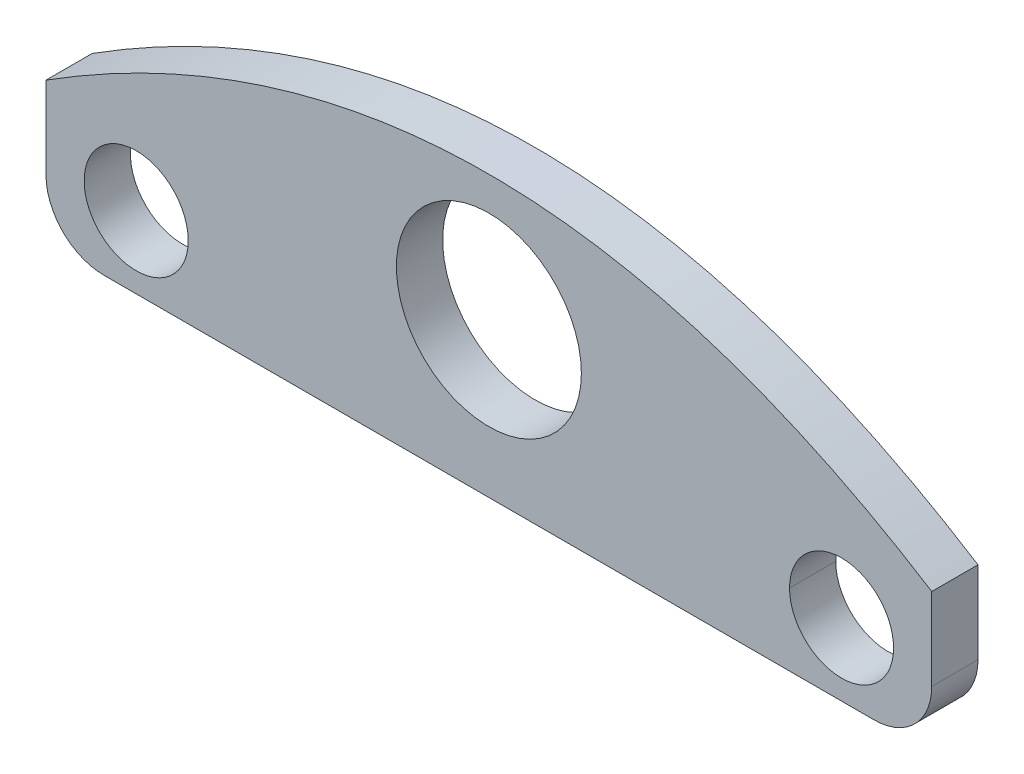
ISO-10303-21;
HEADER;
FILE_DESCRIPTION(('STEP AP214'),'2;1');
FILE_NAME('part.step','',(''),(''),'','','');
FILE_SCHEMA(('AUTOMOTIVE_DESIGN { 1 0 10303 214 1 1 1 1 }'));
ENDSEC;
DATA;
#1=APPLICATION_CONTEXT('core data for automotive mechanical design processes');
#2=APPLICATION_PROTOCOL_DEFINITION('international standard','automotive_design',2000,#1);
#3=PRODUCT_CONTEXT('',#1,'mechanical');
#4=PRODUCT('Part','Part','',(#3));
#5=PRODUCT_RELATED_PRODUCT_CATEGORY('part','',(#4));
#6=PRODUCT_DEFINITION_FORMATION('','',#4);
#7=PRODUCT_DEFINITION_CONTEXT('part definition',#1,'design');
#8=PRODUCT_DEFINITION('design','',#6,#7);
#9=PRODUCT_DEFINITION_SHAPE('','',#8);
#10=(LENGTH_UNIT() NAMED_UNIT(*) SI_UNIT(.MILLI.,.METRE.));
#11=(NAMED_UNIT(*) PLANE_ANGLE_UNIT() SI_UNIT($,.RADIAN.));
#12=(NAMED_UNIT(*) SI_UNIT($,.STERADIAN.) SOLID_ANGLE_UNIT());
#13=UNCERTAINTY_MEASURE_WITH_UNIT(LENGTH_MEASURE(1.E-05),#10,'distance_accuracy_value','');
#14=(GEOMETRIC_REPRESENTATION_CONTEXT(3) GLOBAL_UNCERTAINTY_ASSIGNED_CONTEXT((#13)) GLOBAL_UNIT_ASSIGNED_CONTEXT((#10,
#11,#12)) REPRESENTATION_CONTEXT('',''));
#15=CARTESIAN_POINT('',(0.,0.,0.));
#16=DIRECTION('',(0.,0.,1.));
#17=DIRECTION('',(1.,0.,0.));
#18=AXIS2_PLACEMENT_3D('',#15,#16,#17);
#19=CARTESIAN_POINT('',(12.2,-2.833,1.6));
#20=DIRECTION('',(0.,0.,-1.));
#21=DIRECTION('',(-1.,0.,0.));
#22=AXIS2_PLACEMENT_3D('',#19,#20,#21);
#23=CYLINDRICAL_SURFACE('',#22,1.8);
#24=CARTESIAN_POINT('',(12.2,-2.833,0.));
#25=DIRECTION('',(0.,0.,1.));
#26=DIRECTION('',(1.,0.,0.));
#27=AXIS2_PLACEMENT_3D('',#24,#25,#26);
#28=CIRCLE('',#27,1.8);
#29=CARTESIAN_POINT('',(10.4000006250001,-2.83149999999974,0.));
#30=VERTEX_POINT('',#29);
#31=CARTESIAN_POINT('',(13.9999993749999,-2.83149999999974,0.));
#32=VERTEX_POINT('',#31);
#33=EDGE_CURVE('E180',#30,#32,#28,.T.);
#34=ORIENTED_EDGE('',*,*,#33,.F.);
#35=DIRECTION('',(0.,0.,-1.));
#36=VECTOR('',#35,1.);
#37=CARTESIAN_POINT('',(10.4000006250001,-2.83149999999974,1.6));
#38=LINE('',#37,#36);
#39=CARTESIAN_POINT('',(10.4000006250001,-2.83149999999974,1.6));
#40=VERTEX_POINT('',#39);
#41=EDGE_CURVE('E11',#40,#30,#38,.T.);
#42=ORIENTED_EDGE('',*,*,#41,.F.);
#43=CARTESIAN_POINT('',(12.2,-2.833,1.6));
#44=DIRECTION('',(0.,0.,1.));
#45=DIRECTION('',(1.,0.,0.));
#46=AXIS2_PLACEMENT_3D('',#43,#44,#45);
#47=CIRCLE('',#46,1.8);
#48=CARTESIAN_POINT('',(13.9999993749999,-2.83149999999974,1.6));
#49=VERTEX_POINT('',#48);
#50=EDGE_CURVE('E136',#40,#49,#47,.T.);
#51=ORIENTED_EDGE('',*,*,#50,.T.);
#52=DIRECTION('',(0.,0.,-1.));
#53=VECTOR('',#52,1.);
#54=CARTESIAN_POINT('',(13.9999993749999,-2.83149999999974,1.6));
#55=LINE('',#54,#53);
#56=EDGE_CURVE('E52',#49,#32,#55,.T.);
#57=ORIENTED_EDGE('',*,*,#56,.T.);
#58=EDGE_LOOP('',(#34,#42,#51,#57));
#59=FACE_BOUND('',#58,.T.);
#60=ADVANCED_FACE('F41',(#59),#23,.F.);
#61=CARTESIAN_POINT('',(15.3202188909973,0.,1.6));
#62=DIRECTION('',(-1.,0.,0.));
#63=DIRECTION('',(0.,0.,1.));
#64=AXIS2_PLACEMENT_3D('',#61,#62,#63);
#65=PLANE('',#64);
#66=DIRECTION('',(0.,1.,0.));
#67=VECTOR('',#66,1.);
#68=CARTESIAN_POINT('',(15.3202188909973,0.,0.));
#69=LINE('',#68,#67);
#70=CARTESIAN_POINT('',(15.3202188909973,-3.32150905403799,0.));
#71=VERTEX_POINT('',#70);
#72=CARTESIAN_POINT('',(15.3202188909973,-0.477265386012385,0.));
#73=VERTEX_POINT('',#72);
#74=EDGE_CURVE('E155',#71,#73,#69,.T.);
#75=ORIENTED_EDGE('',*,*,#74,.T.);
#76=DIRECTION('',(0.,0.,-1.));
#77=VECTOR('',#76,1.);
#78=CARTESIAN_POINT('',(15.3202188909973,-0.477265386012385,1.6));
#79=LINE('',#78,#77);
#80=CARTESIAN_POINT('',(15.3202188909973,-0.477265386012385,1.6));
#81=VERTEX_POINT('',#80);
#82=EDGE_CURVE('E45',#81,#73,#79,.T.);
#83=ORIENTED_EDGE('',*,*,#82,.F.);
#84=DIRECTION('',(0.,1.,0.));
#85=VECTOR('',#84,1.);
#86=CARTESIAN_POINT('',(15.3202188909973,0.,1.6));
#87=LINE('',#86,#85);
#88=CARTESIAN_POINT('',(15.3202188909973,-3.32150905403799,1.6));
#89=VERTEX_POINT('',#88);
#90=EDGE_CURVE('E96',#89,#81,#87,.T.);
#91=ORIENTED_EDGE('',*,*,#90,.F.);
#92=DIRECTION('',(0.,0.,-1.));
#93=VECTOR('',#92,1.);
#94=CARTESIAN_POINT('',(15.3202188909973,-3.32150905403799,1.6));
#95=LINE('',#94,#93);
#96=EDGE_CURVE('E113',#89,#71,#95,.T.);
#97=ORIENTED_EDGE('',*,*,#96,.T.);
#98=EDGE_LOOP('',(#75,#83,#91,#97));
#99=FACE_BOUND('',#98,.T.);
#100=ADVANCED_FACE('F43',(#99),#65,.F.);
#101=CARTESIAN_POINT('',(-15.3202188909973,-0.477265386012383,1.6));
#102=CARTESIAN_POINT('',(0.,9.21122195003887,1.6));
#103=CARTESIAN_POINT('',(15.3202188909973,-0.477265386012385,1.6));
#104=B_SPLINE_CURVE_WITH_KNOTS('',2,(#101,#102,#103),.UNSPECIFIED.,.F.,.F.,(3,3),(0.,1.),.UNSPECIFIED.);
#105=DIRECTION('',(0.,0.,-1.));
#106=VECTOR('',#105,1.);
#107=SURFACE_OF_LINEAR_EXTRUSION('',#104,#106);
#108=CARTESIAN_POINT('',(-15.3202188909973,-0.477265386012383,0.));
#109=CARTESIAN_POINT('',(0.,9.21122195003887,0.));
#110=CARTESIAN_POINT('',(15.3202188909973,-0.477265386012385,0.));
#111=B_SPLINE_CURVE_WITH_KNOTS('',2,(#108,#109,#110),.UNSPECIFIED.,.F.,.F.,(3,3),(0.,1.),.UNSPECIFIED.);
#112=CARTESIAN_POINT('',(-15.3202188909973,-0.477265386012383,0.));
#113=VERTEX_POINT('',#112);
#114=EDGE_CURVE('E158',#113,#73,#111,.T.);
#115=ORIENTED_EDGE('',*,*,#114,.F.);
#116=DIRECTION('',(0.,0.,-1.));
#117=VECTOR('',#116,1.);
#118=CARTESIAN_POINT('',(-15.3202188909973,-0.477265386012383,1.6));
#119=LINE('',#118,#117);
#120=CARTESIAN_POINT('',(-15.3202188909973,-0.477265386012383,1.6));
#121=VERTEX_POINT('',#120);
#122=EDGE_CURVE('E204',#121,#113,#119,.T.);
#123=ORIENTED_EDGE('',*,*,#122,.F.);
#124=EDGE_CURVE('E127',#121,#81,#104,.T.);
#125=ORIENTED_EDGE('',*,*,#124,.T.);
#126=ORIENTED_EDGE('',*,*,#82,.T.);
#127=EDGE_LOOP('',(#115,#123,#125,#126));
#128=FACE_BOUND('',#127,.T.);
#129=ADVANCED_FACE('F212',(#128),#107,.T.);
#130=CARTESIAN_POINT('',(-15.3202188909973,0.,1.6));
#131=DIRECTION('',(-1.,0.,0.));
#132=DIRECTION('',(0.,0.,1.));
#133=AXIS2_PLACEMENT_3D('',#130,#131,#132);
#134=PLANE('',#133);
#135=DIRECTION('',(0.,1.,0.));
#136=VECTOR('',#135,1.);
#137=CARTESIAN_POINT('',(-15.3202188909973,0.,0.));
#138=LINE('',#137,#136);
#139=CARTESIAN_POINT('',(-15.3202188909973,-3.32150905403799,0.));
#140=VERTEX_POINT('',#139);
#141=EDGE_CURVE('E164',#140,#113,#138,.T.);
#142=ORIENTED_EDGE('',*,*,#141,.F.);
#143=DIRECTION('',(0.,0.,-1.));
#144=VECTOR('',#143,1.);
#145=CARTESIAN_POINT('',(-15.3202188909973,-3.32150905403799,1.6));
#146=LINE('',#145,#144);
#147=CARTESIAN_POINT('',(-15.3202188909973,-3.32150905403799,1.6));
#148=VERTEX_POINT('',#147);
#149=EDGE_CURVE('E202',#148,#140,#146,.T.);
#150=ORIENTED_EDGE('',*,*,#149,.F.);
#151=DIRECTION('',(0.,1.,0.));
#152=VECTOR('',#151,1.);
#153=CARTESIAN_POINT('',(-15.3202188909973,0.,1.6));
#154=LINE('',#153,#152);
#155=EDGE_CURVE('E221',#148,#121,#154,.T.);
#156=ORIENTED_EDGE('',*,*,#155,.T.);
#157=ORIENTED_EDGE('',*,*,#122,.T.);
#158=EDGE_LOOP('',(#142,#150,#156,#157));
#159=FACE_BOUND('',#158,.T.);
#160=ADVANCED_FACE('F218',(#159),#134,.T.);
#161=CARTESIAN_POINT('',(-13.3202188909973,-3.32150905403801,1.6));
#162=DIRECTION('',(0.,0.,-1.));
#163=DIRECTION('',(-1.,0.,0.));
#164=AXIS2_PLACEMENT_3D('',#161,#162,#163);
#165=CYLINDRICAL_SURFACE('',#164,2.);
#166=CARTESIAN_POINT('',(-13.3202188909973,-3.32150905403801,0.));
#167=DIRECTION('',(0.,0.,1.));
#168=DIRECTION('',(1.,0.,0.));
#169=AXIS2_PLACEMENT_3D('',#166,#167,#168);
#170=CIRCLE('',#169,2.);
#171=CARTESIAN_POINT('',(-13.3202188909973,-5.321509054038,0.));
#172=VERTEX_POINT('',#171);
#173=EDGE_CURVE('E171',#140,#172,#170,.T.);
#174=ORIENTED_EDGE('',*,*,#173,.T.);
#175=DIRECTION('',(0.,0.,-1.));
#176=VECTOR('',#175,1.);
#177=CARTESIAN_POINT('',(-13.3202188909973,-5.321509054038,1.6));
#178=LINE('',#177,#176);
#179=CARTESIAN_POINT('',(-13.3202188909973,-5.321509054038,1.6));
#180=VERTEX_POINT('',#179);
#181=EDGE_CURVE('E198',#180,#172,#178,.T.);
#182=ORIENTED_EDGE('',*,*,#181,.F.);
#183=CARTESIAN_POINT('',(-13.3202188909973,-3.32150905403801,1.6));
#184=DIRECTION('',(0.,0.,1.));
#185=DIRECTION('',(1.,0.,0.));
#186=AXIS2_PLACEMENT_3D('',#183,#184,#185);
#187=CIRCLE('',#186,2.);
#188=EDGE_CURVE('E142',#148,#180,#187,.T.);
#189=ORIENTED_EDGE('',*,*,#188,.F.);
#190=ORIENTED_EDGE('',*,*,#149,.T.);
#191=EDGE_LOOP('',(#174,#182,#189,#190));
#192=FACE_BOUND('',#191,.T.);
#193=ADVANCED_FACE('F224',(#192),#165,.T.);
#194=CARTESIAN_POINT('',(0.,-5.32150905403801,1.6));
#195=DIRECTION('',(0.,1.,0.));
#196=DIRECTION('',(-1.,0.,0.));
#197=AXIS2_PLACEMENT_3D('',#194,#195,#196);
#198=PLANE('',#197);
#199=DIRECTION('',(1.,0.,0.));
#200=VECTOR('',#199,1.);
#201=CARTESIAN_POINT('',(0.,-5.32150905403801,0.));
#202=LINE('',#201,#200);
#203=CARTESIAN_POINT('',(13.3202188909973,-5.32150905403801,0.));
#204=VERTEX_POINT('',#203);
#205=EDGE_CURVE('E174',#172,#204,#202,.T.);
#206=ORIENTED_EDGE('',*,*,#205,.T.);
#207=DIRECTION('',(0.,0.,-1.));
#208=VECTOR('',#207,1.);
#209=CARTESIAN_POINT('',(13.3202188909973,-5.32150905403801,1.6));
#210=LINE('',#209,#208);
#211=CARTESIAN_POINT('',(13.3202188909973,-5.32150905403801,1.6));
#212=VERTEX_POINT('',#211);
#213=EDGE_CURVE('E122',#212,#204,#210,.T.);
#214=ORIENTED_EDGE('',*,*,#213,.F.);
#215=DIRECTION('',(1.,0.,0.));
#216=VECTOR('',#215,1.);
#217=CARTESIAN_POINT('',(0.,-5.32150905403801,1.6));
#218=LINE('',#217,#216);
#219=EDGE_CURVE('E133',#180,#212,#218,.T.);
#220=ORIENTED_EDGE('',*,*,#219,.F.);
#221=ORIENTED_EDGE('',*,*,#181,.T.);
#222=EDGE_LOOP('',(#206,#214,#220,#221));
#223=FACE_BOUND('',#222,.T.);
#224=ADVANCED_FACE('F242',(#223),#198,.F.);
#225=CARTESIAN_POINT('',(0.,0.,1.6));
#226=DIRECTION('',(0.,0.,-1.));
#227=DIRECTION('',(-1.,0.,0.));
#228=AXIS2_PLACEMENT_3D('',#225,#226,#227);
#229=CYLINDRICAL_SURFACE('',#228,3.2);
#230=CARTESIAN_POINT('',(0.,0.,1.6));
#231=DIRECTION('',(0.,0.,1.));
#232=DIRECTION('',(1.,0.,0.));
#233=AXIS2_PLACEMENT_3D('',#230,#231,#232);
#234=CIRCLE('',#233,3.2);
#235=CARTESIAN_POINT('',(3.2,0.,1.6));
#236=VERTEX_POINT('',#235);
#237=EDGE_CURVE('E148',#236,#236,#234,.T.);
#238=ORIENTED_EDGE('',*,*,#237,.T.);
#239=EDGE_LOOP('',(#238));
#240=FACE_BOUND('',#239,.T.);
#241=CARTESIAN_POINT('',(0.,0.,0.));
#242=DIRECTION('',(0.,0.,1.));
#243=DIRECTION('',(1.,0.,0.));
#244=AXIS2_PLACEMENT_3D('',#241,#242,#243);
#245=CIRCLE('',#244,3.2);
#246=CARTESIAN_POINT('',(3.2,0.,0.));
#247=VERTEX_POINT('',#246);
#248=EDGE_CURVE('E187',#247,#247,#245,.T.);
#249=ORIENTED_EDGE('',*,*,#248,.F.);
#250=EDGE_LOOP('',(#249));
#251=FACE_BOUND('',#250,.T.);
#252=ADVANCED_FACE('F245',(#240,#251),#229,.F.);
#253=CARTESIAN_POINT('',(12.2,-2.83,1.6));
#254=DIRECTION('',(0.,0.,-1.));
#255=DIRECTION('',(-1.,0.,0.));
#256=AXIS2_PLACEMENT_3D('',#253,#254,#255);
#257=CYLINDRICAL_SURFACE('',#256,1.8);
#258=CARTESIAN_POINT('',(12.2,-2.83,0.));
#259=DIRECTION('',(0.,0.,1.));
#260=DIRECTION('',(1.,0.,0.));
#261=AXIS2_PLACEMENT_3D('',#258,#259,#260);
#262=CIRCLE('',#261,1.8);
#263=EDGE_CURVE('E183',#32,#30,#262,.T.);
#264=ORIENTED_EDGE('',*,*,#263,.F.);
#265=ORIENTED_EDGE('',*,*,#56,.F.);
#266=CARTESIAN_POINT('',(12.2,-2.83,1.6));
#267=DIRECTION('',(0.,0.,1.));
#268=DIRECTION('',(1.,0.,0.));
#269=AXIS2_PLACEMENT_3D('',#266,#267,#268);
#270=CIRCLE('',#269,1.8);
#271=EDGE_CURVE('E140',#49,#40,#270,.T.);
#272=ORIENTED_EDGE('',*,*,#271,.T.);
#273=ORIENTED_EDGE('',*,*,#41,.T.);
#274=EDGE_LOOP('',(#264,#265,#272,#273));
#275=FACE_BOUND('',#274,.T.);
#276=ADVANCED_FACE('F250',(#275),#257,.F.);
#277=CARTESIAN_POINT('',(13.3202188909973,-3.32150905403801,1.6));
#278=DIRECTION('',(0.,0.,-1.));
#279=DIRECTION('',(-1.,0.,0.));
#280=AXIS2_PLACEMENT_3D('',#277,#278,#279);
#281=CYLINDRICAL_SURFACE('',#280,2.);
#282=CARTESIAN_POINT('',(13.3202188909973,-3.32150905403801,0.));
#283=DIRECTION('',(0.,0.,1.));
#284=DIRECTION('',(1.,0.,0.));
#285=AXIS2_PLACEMENT_3D('',#282,#283,#284);
#286=CIRCLE('',#285,2.);
#287=EDGE_CURVE('E117',#71,#204,#286,.F.);
#288=ORIENTED_EDGE('',*,*,#287,.F.);
#289=ORIENTED_EDGE('',*,*,#96,.F.);
#290=CARTESIAN_POINT('',(13.3202188909973,-3.32150905403801,1.6));
#291=DIRECTION('',(0.,0.,1.));
#292=DIRECTION('',(1.,0.,0.));
#293=AXIS2_PLACEMENT_3D('',#290,#291,#292);
#294=CIRCLE('',#293,2.);
#295=EDGE_CURVE('E115',#89,#212,#294,.F.);
#296=ORIENTED_EDGE('',*,*,#295,.T.);
#297=ORIENTED_EDGE('',*,*,#213,.T.);
#298=EDGE_LOOP('',(#288,#289,#296,#297));
#299=FACE_BOUND('',#298,.T.);
#300=ADVANCED_FACE('F114',(#299),#281,.T.);
#301=CARTESIAN_POINT('',(-12.2,-2.83,1.6));
#302=DIRECTION('',(0.,0.,-1.));
#303=DIRECTION('',(-1.,0.,0.));
#304=AXIS2_PLACEMENT_3D('',#301,#302,#303);
#305=CYLINDRICAL_SURFACE('',#304,1.8);
#306=CARTESIAN_POINT('',(-12.2,-2.83,1.6));
#307=DIRECTION('',(0.,0.,1.));
#308=DIRECTION('',(1.,0.,0.));
#309=AXIS2_PLACEMENT_3D('',#306,#307,#308);
#310=CIRCLE('',#309,1.8);
#311=CARTESIAN_POINT('',(-10.4,-2.83,1.6));
#312=VERTEX_POINT('',#311);
#313=EDGE_CURVE('E123',#312,#312,#310,.F.);
#314=ORIENTED_EDGE('',*,*,#313,.F.);
#315=EDGE_LOOP('',(#314));
#316=FACE_BOUND('',#315,.T.);
#317=CARTESIAN_POINT('',(-12.2,-2.83,0.));
#318=DIRECTION('',(0.,0.,1.));
#319=DIRECTION('',(1.,0.,0.));
#320=AXIS2_PLACEMENT_3D('',#317,#318,#319);
#321=CIRCLE('',#320,1.8);
#322=CARTESIAN_POINT('',(-10.4,-2.83,0.));
#323=VERTEX_POINT('',#322);
#324=EDGE_CURVE('E128',#323,#323,#321,.F.);
#325=ORIENTED_EDGE('',*,*,#324,.T.);
#326=EDGE_LOOP('',(#325));
#327=FACE_BOUND('',#326,.T.);
#328=ADVANCED_FACE('F249',(#316,#327),#305,.F.);
#329=CARTESIAN_POINT('',(0.,0.,1.6));
#330=DIRECTION('',(0.,0.,1.));
#331=DIRECTION('',(1.,0.,0.));
#332=AXIS2_PLACEMENT_3D('',#329,#330,#331);
#333=PLANE('',#332);
#334=ORIENTED_EDGE('',*,*,#90,.T.);
#335=ORIENTED_EDGE('',*,*,#124,.F.);
#336=ORIENTED_EDGE('',*,*,#155,.F.);
#337=ORIENTED_EDGE('',*,*,#188,.T.);
#338=ORIENTED_EDGE('',*,*,#219,.T.);
#339=ORIENTED_EDGE('',*,*,#295,.F.);
#340=EDGE_LOOP('',(#334,#335,#336,#337,#338,#339));
#341=FACE_BOUND('',#340,.T.);
#342=ORIENTED_EDGE('',*,*,#50,.F.);
#343=ORIENTED_EDGE('',*,*,#271,.F.);
#344=EDGE_LOOP('',(#342,#343));
#345=FACE_BOUND('',#344,.T.);
#346=ORIENTED_EDGE('',*,*,#237,.F.);
#347=EDGE_LOOP('',(#346));
#348=FACE_BOUND('',#347,.T.);
#349=ORIENTED_EDGE('',*,*,#313,.T.);
#350=EDGE_LOOP('',(#349));
#351=FACE_BOUND('',#350,.T.);
#352=ADVANCED_FACE('F130',(#341,#345,#348,#351),#333,.T.);
#353=CARTESIAN_POINT('',(0.,0.,0.));
#354=DIRECTION('',(0.,0.,1.));
#355=DIRECTION('',(1.,0.,0.));
#356=AXIS2_PLACEMENT_3D('',#353,#354,#355);
#357=PLANE('',#356);
#358=ORIENTED_EDGE('',*,*,#74,.F.);
#359=ORIENTED_EDGE('',*,*,#287,.T.);
#360=ORIENTED_EDGE('',*,*,#205,.F.);
#361=ORIENTED_EDGE('',*,*,#173,.F.);
#362=ORIENTED_EDGE('',*,*,#141,.T.);
#363=ORIENTED_EDGE('',*,*,#114,.T.);
#364=EDGE_LOOP('',(#358,#359,#360,#361,#362,#363));
#365=FACE_BOUND('',#364,.T.);
#366=ORIENTED_EDGE('',*,*,#33,.T.);
#367=ORIENTED_EDGE('',*,*,#263,.T.);
#368=EDGE_LOOP('',(#366,#367));
#369=FACE_BOUND('',#368,.T.);
#370=ORIENTED_EDGE('',*,*,#248,.T.);
#371=EDGE_LOOP('',(#370));
#372=FACE_BOUND('',#371,.T.);
#373=ORIENTED_EDGE('',*,*,#324,.F.);
#374=EDGE_LOOP('',(#373));
#375=FACE_BOUND('',#374,.T.);
#376=ADVANCED_FACE('F214',(#365,#369,#372,#375),#357,.F.);
#377=CLOSED_SHELL('',(#60,#100,#129,#160,#193,#224,#252,#276,#300,#328,#352,#376));
#378=MANIFOLD_SOLID_BREP('B2',#377);
#379=ADVANCED_BREP_SHAPE_REPRESENTATION('',(#18,#378),#14);
#380=SHAPE_DEFINITION_REPRESENTATION(#9,#379);
ENDSEC;
END-ISO-10303-21;
